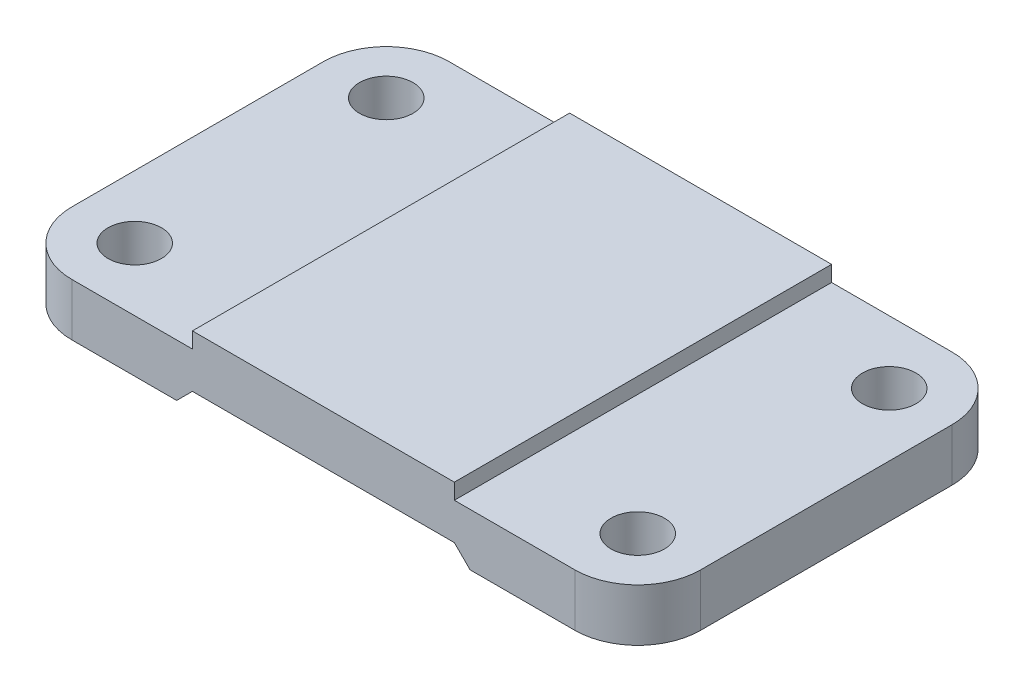
ISO-10303-21;
HEADER;
FILE_DESCRIPTION(('STEP AP214'),'2;1');
FILE_NAME('part.step','',(''),(''),'','','');
FILE_SCHEMA(('AUTOMOTIVE_DESIGN { 1 0 10303 214 1 1 1 1 }'));
ENDSEC;
DATA;
#1=APPLICATION_CONTEXT('core data for automotive mechanical design processes');
#2=APPLICATION_PROTOCOL_DEFINITION('international standard','automotive_design',2000,#1);
#3=PRODUCT_CONTEXT('',#1,'mechanical');
#4=PRODUCT('Part','Part','',(#3));
#5=PRODUCT_RELATED_PRODUCT_CATEGORY('part','',(#4));
#6=PRODUCT_DEFINITION_FORMATION('','',#4);
#7=PRODUCT_DEFINITION_CONTEXT('part definition',#1,'design');
#8=PRODUCT_DEFINITION('design','',#6,#7);
#9=PRODUCT_DEFINITION_SHAPE('','',#8);
#10=(LENGTH_UNIT() NAMED_UNIT(*) SI_UNIT(.MILLI.,.METRE.));
#11=(NAMED_UNIT(*) PLANE_ANGLE_UNIT() SI_UNIT($,.RADIAN.));
#12=(NAMED_UNIT(*) SI_UNIT($,.STERADIAN.) SOLID_ANGLE_UNIT());
#13=UNCERTAINTY_MEASURE_WITH_UNIT(LENGTH_MEASURE(1.E-05),#10,'distance_accuracy_value','');
#14=(GEOMETRIC_REPRESENTATION_CONTEXT(3) GLOBAL_UNCERTAINTY_ASSIGNED_CONTEXT((#13)) GLOBAL_UNIT_ASSIGNED_CONTEXT((#10,
#11,#12)) REPRESENTATION_CONTEXT('',''));
#15=CARTESIAN_POINT('',(0.,0.,0.));
#16=DIRECTION('',(0.,0.,1.));
#17=DIRECTION('',(1.,0.,0.));
#18=AXIS2_PLACEMENT_3D('',#15,#16,#17);
#19=CARTESIAN_POINT('',(48.,13.,36.));
#20=DIRECTION('',(0.,0.,1.));
#21=DIRECTION('',(1.,0.,0.));
#22=AXIS2_PLACEMENT_3D('',#19,#20,#21);
#23=PLANE('',#22);
#24=DIRECTION('',(-1.,0.,0.));
#25=VECTOR('',#24,1.);
#26=CARTESIAN_POINT('',(48.,0.,36.));
#27=LINE('',#26,#25);
#28=CARTESIAN_POINT('',(-28.,0.,36.));
#29=VERTEX_POINT('',#28);
#30=CARTESIAN_POINT('',(-48.,0.,36.));
#31=VERTEX_POINT('',#30);
#32=EDGE_CURVE('E286',#29,#31,#27,.T.);
#33=ORIENTED_EDGE('',*,*,#32,.F.);
#34=DIRECTION('',(0.707106781186546,0.707106781186549,0.));
#35=VECTOR('',#34,1.);
#36=CARTESIAN_POINT('',(-14.,14.,36.));
#37=LINE('',#36,#35);
#38=CARTESIAN_POINT('',(-25.,3.,36.));
#39=VERTEX_POINT('',#38);
#40=EDGE_CURVE('E268',#29,#39,#37,.T.);
#41=ORIENTED_EDGE('',*,*,#40,.T.);
#42=DIRECTION('',(1.,0.,0.));
#43=VECTOR('',#42,1.);
#44=CARTESIAN_POINT('',(0.,3.,36.));
#45=LINE('',#44,#43);
#46=CARTESIAN_POINT('',(25.,3.,36.));
#47=VERTEX_POINT('',#46);
#48=EDGE_CURVE('E480',#39,#47,#45,.T.);
#49=ORIENTED_EDGE('',*,*,#48,.T.);
#50=DIRECTION('',(-0.707106781186548,0.707106781186547,0.));
#51=VECTOR('',#50,1.);
#52=CARTESIAN_POINT('',(14.,14.,36.));
#53=LINE('',#52,#51);
#54=CARTESIAN_POINT('',(28.,0.,36.));
#55=VERTEX_POINT('',#54);
#56=EDGE_CURVE('E280',#55,#47,#53,.T.);
#57=ORIENTED_EDGE('',*,*,#56,.F.);
#58=CARTESIAN_POINT('',(48.,0.,36.));
#59=VERTEX_POINT('',#58);
#60=EDGE_CURVE('E298',#59,#55,#27,.T.);
#61=ORIENTED_EDGE('',*,*,#60,.F.);
#62=DIRECTION('',(0.,-1.,0.));
#63=VECTOR('',#62,1.);
#64=CARTESIAN_POINT('',(48.,13.,36.));
#65=LINE('',#64,#63);
#66=CARTESIAN_POINT('',(48.,10.,36.));
#67=VERTEX_POINT('',#66);
#68=EDGE_CURVE('E162',#67,#59,#65,.T.);
#69=ORIENTED_EDGE('',*,*,#68,.F.);
#70=DIRECTION('',(1.,0.,0.));
#71=VECTOR('',#70,1.);
#72=CARTESIAN_POINT('',(25.,10.,36.));
#73=LINE('',#72,#71);
#74=CARTESIAN_POINT('',(25.,10.,36.));
#75=VERTEX_POINT('',#74);
#76=EDGE_CURVE('E402',#75,#67,#73,.T.);
#77=ORIENTED_EDGE('',*,*,#76,.F.);
#78=DIRECTION('',(0.,-1.,0.));
#79=VECTOR('',#78,1.);
#80=CARTESIAN_POINT('',(25.,13.,36.));
#81=LINE('',#80,#79);
#82=CARTESIAN_POINT('',(25.,13.,36.));
#83=VERTEX_POINT('',#82);
#84=EDGE_CURVE('E398',#83,#75,#81,.T.);
#85=ORIENTED_EDGE('',*,*,#84,.F.);
#86=DIRECTION('',(-1.,0.,0.));
#87=VECTOR('',#86,1.);
#88=CARTESIAN_POINT('',(48.,13.,36.));
#89=LINE('',#88,#87);
#90=CARTESIAN_POINT('',(-25.,13.,36.));
#91=VERTEX_POINT('',#90);
#92=EDGE_CURVE('E332',#83,#91,#89,.T.);
#93=ORIENTED_EDGE('',*,*,#92,.T.);
#94=DIRECTION('',(0.,-1.,0.));
#95=VECTOR('',#94,1.);
#96=CARTESIAN_POINT('',(-25.,13.,36.));
#97=LINE('',#96,#95);
#98=CARTESIAN_POINT('',(-25.,10.,36.));
#99=VERTEX_POINT('',#98);
#100=EDGE_CURVE('E472',#91,#99,#97,.T.);
#101=ORIENTED_EDGE('',*,*,#100,.T.);
#102=DIRECTION('',(-1.,0.,0.));
#103=VECTOR('',#102,1.);
#104=CARTESIAN_POINT('',(-25.,10.,36.));
#105=LINE('',#104,#103);
#106=CARTESIAN_POINT('',(-48.,10.,36.));
#107=VERTEX_POINT('',#106);
#108=EDGE_CURVE('E404',#99,#107,#105,.T.);
#109=ORIENTED_EDGE('',*,*,#108,.T.);
#110=DIRECTION('',(0.,-1.,0.));
#111=VECTOR('',#110,1.);
#112=CARTESIAN_POINT('',(-48.,13.,36.));
#113=LINE('',#112,#111);
#114=EDGE_CURVE('E12',#107,#31,#113,.T.);
#115=ORIENTED_EDGE('',*,*,#114,.T.);
#116=EDGE_LOOP('',(#33,#41,#49,#57,#61,#69,#77,#85,#93,#101,#109,#115));
#117=FACE_BOUND('',#116,.T.);
#118=ADVANCED_FACE('F152',(#117),#23,.T.);
#119=CARTESIAN_POINT('',(-48.,13.,-36.));
#120=DIRECTION('',(0.,0.,-1.));
#121=DIRECTION('',(-1.,0.,0.));
#122=AXIS2_PLACEMENT_3D('',#119,#120,#121);
#123=PLANE('',#122);
#124=DIRECTION('',(1.,0.,0.));
#125=VECTOR('',#124,1.);
#126=CARTESIAN_POINT('',(0.,3.,-36.));
#127=LINE('',#126,#125);
#128=CARTESIAN_POINT('',(-25.,3.,-36.));
#129=VERTEX_POINT('',#128);
#130=CARTESIAN_POINT('',(25.,3.,-36.));
#131=VERTEX_POINT('',#130);
#132=EDGE_CURVE('E292',#129,#131,#127,.T.);
#133=ORIENTED_EDGE('',*,*,#132,.F.);
#134=DIRECTION('',(0.707106781186546,0.707106781186549,0.));
#135=VECTOR('',#134,1.);
#136=CARTESIAN_POINT('',(-14.,14.,-36.));
#137=LINE('',#136,#135);
#138=CARTESIAN_POINT('',(-28.,0.,-36.));
#139=VERTEX_POINT('',#138);
#140=EDGE_CURVE('E481',#139,#129,#137,.T.);
#141=ORIENTED_EDGE('',*,*,#140,.F.);
#142=DIRECTION('',(1.,0.,0.));
#143=VECTOR('',#142,1.);
#144=CARTESIAN_POINT('',(-48.,0.,-36.));
#145=LINE('',#144,#143);
#146=CARTESIAN_POINT('',(-48.,0.,-36.));
#147=VERTEX_POINT('',#146);
#148=EDGE_CURVE('E289',#147,#139,#145,.T.);
#149=ORIENTED_EDGE('',*,*,#148,.F.);
#150=DIRECTION('',(0.,-1.,0.));
#151=VECTOR('',#150,1.);
#152=CARTESIAN_POINT('',(-48.,13.,-36.));
#153=LINE('',#152,#151);
#154=CARTESIAN_POINT('',(-48.,10.,-36.));
#155=VERTEX_POINT('',#154);
#156=EDGE_CURVE('E340',#155,#147,#153,.T.);
#157=ORIENTED_EDGE('',*,*,#156,.F.);
#158=DIRECTION('',(-1.,0.,0.));
#159=VECTOR('',#158,1.);
#160=CARTESIAN_POINT('',(-25.,10.,-36.));
#161=LINE('',#160,#159);
#162=CARTESIAN_POINT('',(-25.,10.,-36.));
#163=VERTEX_POINT('',#162);
#164=EDGE_CURVE('E492',#163,#155,#161,.T.);
#165=ORIENTED_EDGE('',*,*,#164,.F.);
#166=DIRECTION('',(0.,-1.,0.));
#167=VECTOR('',#166,1.);
#168=CARTESIAN_POINT('',(-25.,13.,-36.));
#169=LINE('',#168,#167);
#170=CARTESIAN_POINT('',(-25.,13.,-36.));
#171=VERTEX_POINT('',#170);
#172=EDGE_CURVE('E379',#171,#163,#169,.T.);
#173=ORIENTED_EDGE('',*,*,#172,.F.);
#174=DIRECTION('',(1.,0.,0.));
#175=VECTOR('',#174,1.);
#176=CARTESIAN_POINT('',(-48.,13.,-36.));
#177=LINE('',#176,#175);
#178=CARTESIAN_POINT('',(25.,13.,-36.));
#179=VERTEX_POINT('',#178);
#180=EDGE_CURVE('E337',#171,#179,#177,.T.);
#181=ORIENTED_EDGE('',*,*,#180,.T.);
#182=DIRECTION('',(0.,-1.,0.));
#183=VECTOR('',#182,1.);
#184=CARTESIAN_POINT('',(25.,13.,-36.));
#185=LINE('',#184,#183);
#186=CARTESIAN_POINT('',(25.,10.,-36.));
#187=VERTEX_POINT('',#186);
#188=EDGE_CURVE('E393',#179,#187,#185,.T.);
#189=ORIENTED_EDGE('',*,*,#188,.T.);
#190=DIRECTION('',(1.,0.,0.));
#191=VECTOR('',#190,1.);
#192=CARTESIAN_POINT('',(25.,10.,-36.));
#193=LINE('',#192,#191);
#194=CARTESIAN_POINT('',(48.,10.,-36.));
#195=VERTEX_POINT('',#194);
#196=EDGE_CURVE('E178',#187,#195,#193,.T.);
#197=ORIENTED_EDGE('',*,*,#196,.T.);
#198=DIRECTION('',(0.,-1.,0.));
#199=VECTOR('',#198,1.);
#200=CARTESIAN_POINT('',(48.,13.,-36.));
#201=LINE('',#200,#199);
#202=CARTESIAN_POINT('',(48.,0.,-36.));
#203=VERTEX_POINT('',#202);
#204=EDGE_CURVE('E343',#195,#203,#201,.T.);
#205=ORIENTED_EDGE('',*,*,#204,.T.);
#206=CARTESIAN_POINT('',(28.,0.,-36.));
#207=VERTEX_POINT('',#206);
#208=EDGE_CURVE('E322',#207,#203,#145,.T.);
#209=ORIENTED_EDGE('',*,*,#208,.F.);
#210=DIRECTION('',(-0.707106781186548,0.707106781186547,0.));
#211=VECTOR('',#210,1.);
#212=CARTESIAN_POINT('',(14.,14.,-36.));
#213=LINE('',#212,#211);
#214=EDGE_CURVE('E170',#207,#131,#213,.T.);
#215=ORIENTED_EDGE('',*,*,#214,.T.);
#216=EDGE_LOOP('',(#133,#141,#149,#157,#165,#173,#181,#189,#197,#205,#209,#215));
#217=FACE_BOUND('',#216,.T.);
#218=ADVANCED_FACE('F445',(#217),#123,.T.);
#219=CARTESIAN_POINT('',(-48.,0.,24.));
#220=DIRECTION('',(0.,1.,0.));
#221=DIRECTION('',(0.,0.,1.));
#222=AXIS2_PLACEMENT_3D('',#219,#220,#221);
#223=PLANE('',#222);
#224=CARTESIAN_POINT('',(-48.,0.,24.));
#225=DIRECTION('',(0.,1.,0.));
#226=DIRECTION('',(0.,0.,1.));
#227=AXIS2_PLACEMENT_3D('',#224,#225,#226);
#228=CIRCLE('',#227,5.1);
#229=CARTESIAN_POINT('',(-48.,0.,18.9));
#230=VERTEX_POINT('',#229);
#231=EDGE_CURVE('E307',#230,#230,#228,.T.);
#232=ORIENTED_EDGE('',*,*,#231,.T.);
#233=EDGE_LOOP('',(#232));
#234=FACE_BOUND('',#233,.T.);
#235=CARTESIAN_POINT('',(-48.,0.,-24.));
#236=DIRECTION('',(0.,1.,0.));
#237=DIRECTION('',(0.,0.,1.));
#238=AXIS2_PLACEMENT_3D('',#235,#236,#237);
#239=CIRCLE('',#238,5.1);
#240=CARTESIAN_POINT('',(-48.,0.,-29.1));
#241=VERTEX_POINT('',#240);
#242=EDGE_CURVE('E431',#241,#241,#239,.T.);
#243=ORIENTED_EDGE('',*,*,#242,.T.);
#244=EDGE_LOOP('',(#243));
#245=FACE_BOUND('',#244,.T.);
#246=DIRECTION('',(0.,0.,1.));
#247=VECTOR('',#246,1.);
#248=CARTESIAN_POINT('',(-28.,0.,-36.));
#249=LINE('',#248,#247);
#250=EDGE_CURVE('E271',#139,#29,#249,.T.);
#251=ORIENTED_EDGE('',*,*,#250,.T.);
#252=ORIENTED_EDGE('',*,*,#32,.T.);
#253=CARTESIAN_POINT('',(-48.,0.,24.));
#254=DIRECTION('',(0.,1.,0.));
#255=DIRECTION('',(0.,0.,1.));
#256=AXIS2_PLACEMENT_3D('',#253,#254,#255);
#257=CIRCLE('',#256,12.);
#258=CARTESIAN_POINT('',(-60.,0.,24.));
#259=VERTEX_POINT('',#258);
#260=EDGE_CURVE('E299',#259,#31,#257,.T.);
#261=ORIENTED_EDGE('',*,*,#260,.F.);
#262=DIRECTION('',(0.,0.,-1.));
#263=VECTOR('',#262,1.);
#264=CARTESIAN_POINT('',(-60.,0.,24.));
#265=LINE('',#264,#263);
#266=CARTESIAN_POINT('',(-60.,0.,-24.));
#267=VERTEX_POINT('',#266);
#268=EDGE_CURVE('E328',#259,#267,#265,.T.);
#269=ORIENTED_EDGE('',*,*,#268,.T.);
#270=CARTESIAN_POINT('',(-48.,0.,-24.));
#271=DIRECTION('',(0.,-1.,0.));
#272=DIRECTION('',(0.,0.,-1.));
#273=AXIS2_PLACEMENT_3D('',#270,#271,#272);
#274=CIRCLE('',#273,12.);
#275=EDGE_CURVE('E325',#267,#147,#274,.T.);
#276=ORIENTED_EDGE('',*,*,#275,.T.);
#277=ORIENTED_EDGE('',*,*,#148,.T.);
#278=EDGE_LOOP('',(#251,#252,#261,#269,#276,#277));
#279=FACE_BOUND('',#278,.T.);
#280=ADVANCED_FACE('F284',(#234,#245,#279),#223,.F.);
#281=CARTESIAN_POINT('',(-48.,13.,24.));
#282=DIRECTION('',(0.,1.,0.));
#283=DIRECTION('',(0.,0.,1.));
#284=AXIS2_PLACEMENT_3D('',#281,#282,#283);
#285=PLANE('',#284);
#286=ORIENTED_EDGE('',*,*,#180,.F.);
#287=DIRECTION('',(0.,0.,1.));
#288=VECTOR('',#287,1.);
#289=CARTESIAN_POINT('',(-25.,13.,-36.));
#290=LINE('',#289,#288);
#291=EDGE_CURVE('E358',#171,#91,#290,.T.);
#292=ORIENTED_EDGE('',*,*,#291,.T.);
#293=ORIENTED_EDGE('',*,*,#92,.F.);
#294=DIRECTION('',(0.,0.,1.));
#295=VECTOR('',#294,1.);
#296=CARTESIAN_POINT('',(25.,13.,-36.));
#297=LINE('',#296,#295);
#298=EDGE_CURVE('E391',#179,#83,#297,.T.);
#299=ORIENTED_EDGE('',*,*,#298,.F.);
#300=EDGE_LOOP('',(#286,#292,#293,#299));
#301=FACE_BOUND('',#300,.T.);
#302=ADVANCED_FACE('F448',(#301),#285,.T.);
#303=CARTESIAN_POINT('',(-48.,13.,24.));
#304=DIRECTION('',(0.,-1.,0.));
#305=DIRECTION('',(0.,0.,-1.));
#306=AXIS2_PLACEMENT_3D('',#303,#304,#305);
#307=CYLINDRICAL_SURFACE('',#306,12.);
#308=CARTESIAN_POINT('',(-48.,10.,24.));
#309=DIRECTION('',(0.,1.,0.));
#310=DIRECTION('',(-1.,0.,0.));
#311=AXIS2_PLACEMENT_3D('',#308,#309,#310);
#312=CIRCLE('',#311,12.);
#313=CARTESIAN_POINT('',(-60.,10.,24.));
#314=VERTEX_POINT('',#313);
#315=EDGE_CURVE('E420',#314,#107,#312,.T.);
#316=ORIENTED_EDGE('',*,*,#315,.F.);
#317=DIRECTION('',(0.,-1.,0.));
#318=VECTOR('',#317,1.);
#319=CARTESIAN_POINT('',(-60.,13.,24.));
#320=LINE('',#319,#318);
#321=EDGE_CURVE('E333',#314,#259,#320,.T.);
#322=ORIENTED_EDGE('',*,*,#321,.T.);
#323=ORIENTED_EDGE('',*,*,#260,.T.);
#324=ORIENTED_EDGE('',*,*,#114,.F.);
#325=EDGE_LOOP('',(#316,#322,#323,#324));
#326=FACE_BOUND('',#325,.T.);
#327=ADVANCED_FACE('F154',(#326),#307,.T.);
#328=CARTESIAN_POINT('',(-48.,13.,-24.));
#329=DIRECTION('',(0.,-1.,0.));
#330=DIRECTION('',(0.,0.,-1.));
#331=AXIS2_PLACEMENT_3D('',#328,#329,#330);
#332=CYLINDRICAL_SURFACE('',#331,12.);
#333=DIRECTION('',(0.,-1.,0.));
#334=VECTOR('',#333,1.);
#335=CARTESIAN_POINT('',(-60.,13.,-24.));
#336=LINE('',#335,#334);
#337=CARTESIAN_POINT('',(-60.,10.,-24.));
#338=VERTEX_POINT('',#337);
#339=EDGE_CURVE('E336',#338,#267,#336,.T.);
#340=ORIENTED_EDGE('',*,*,#339,.F.);
#341=CARTESIAN_POINT('',(-48.,10.,-24.));
#342=DIRECTION('',(0.,1.,0.));
#343=DIRECTION('',(-1.,0.,0.));
#344=AXIS2_PLACEMENT_3D('',#341,#342,#343);
#345=CIRCLE('',#344,12.);
#346=EDGE_CURVE('E416',#338,#155,#345,.F.);
#347=ORIENTED_EDGE('',*,*,#346,.T.);
#348=ORIENTED_EDGE('',*,*,#156,.T.);
#349=ORIENTED_EDGE('',*,*,#275,.F.);
#350=EDGE_LOOP('',(#340,#347,#348,#349));
#351=FACE_BOUND('',#350,.T.);
#352=ADVANCED_FACE('F505',(#351),#332,.T.);
#353=CARTESIAN_POINT('',(-60.,13.,24.));
#354=DIRECTION('',(-1.,0.,0.));
#355=DIRECTION('',(0.,0.,1.));
#356=AXIS2_PLACEMENT_3D('',#353,#354,#355);
#357=PLANE('',#356);
#358=ORIENTED_EDGE('',*,*,#321,.F.);
#359=DIRECTION('',(0.,0.,1.));
#360=VECTOR('',#359,1.);
#361=CARTESIAN_POINT('',(-60.,10.,-36.));
#362=LINE('',#361,#360);
#363=EDGE_CURVE('E376',#338,#314,#362,.T.);
#364=ORIENTED_EDGE('',*,*,#363,.F.);
#365=ORIENTED_EDGE('',*,*,#339,.T.);
#366=ORIENTED_EDGE('',*,*,#268,.F.);
#367=EDGE_LOOP('',(#358,#364,#365,#366));
#368=FACE_BOUND('',#367,.T.);
#369=ADVANCED_FACE('F510',(#368),#357,.T.);
#370=CARTESIAN_POINT('',(-48.,13.,24.));
#371=DIRECTION('',(0.,-1.,0.));
#372=DIRECTION('',(0.,0.,-1.));
#373=AXIS2_PLACEMENT_3D('',#370,#371,#372);
#374=CYLINDRICAL_SURFACE('',#373,5.1);
#375=CARTESIAN_POINT('',(-48.,10.,24.));
#376=DIRECTION('',(0.,1.,0.));
#377=DIRECTION('',(-1.,0.,0.));
#378=AXIS2_PLACEMENT_3D('',#375,#376,#377);
#379=CIRCLE('',#378,5.1);
#380=CARTESIAN_POINT('',(-48.,10.,18.9));
#381=VERTEX_POINT('',#380);
#382=EDGE_CURVE('E412',#381,#381,#379,.T.);
#383=CARTESIAN_POINT('',(-48.,0.,18.9));
#384=CARTESIAN_POINT('',(-48.,0.104166666666667,18.9));
#385=CARTESIAN_POINT('',(-48.,0.208333333333334,18.9));
#386=CARTESIAN_POINT('',(-48.,0.416666666666667,18.9));
#387=CARTESIAN_POINT('',(-48.,0.520833333333334,18.9));
#388=CARTESIAN_POINT('',(-48.,0.729166666666667,18.9));
#389=CARTESIAN_POINT('',(-48.,0.833333333333334,18.9));
#390=CARTESIAN_POINT('',(-48.,1.04166666666667,18.9));
#391=CARTESIAN_POINT('',(-48.,1.14583333333333,18.9));
#392=CARTESIAN_POINT('',(-48.,1.35416666666667,18.9));
#393=CARTESIAN_POINT('',(-48.,1.45833333333333,18.9));
#394=CARTESIAN_POINT('',(-48.,1.66666666666667,18.9));
#395=CARTESIAN_POINT('',(-48.,1.77083333333333,18.9));
#396=CARTESIAN_POINT('',(-48.,1.97916666666667,18.9));
#397=CARTESIAN_POINT('',(-48.,2.08333333333333,18.9));
#398=CARTESIAN_POINT('',(-48.,2.29166666666667,18.9));
#399=CARTESIAN_POINT('',(-48.,2.39583333333333,18.9));
#400=CARTESIAN_POINT('',(-48.,2.60416666666667,18.9));
#401=CARTESIAN_POINT('',(-48.,2.70833333333333,18.9));
#402=CARTESIAN_POINT('',(-48.,2.91666666666667,18.9));
#403=CARTESIAN_POINT('',(-48.,3.02083333333333,18.9));
#404=CARTESIAN_POINT('',(-48.,3.22916666666667,18.9));
#405=CARTESIAN_POINT('',(-48.,3.33333333333333,18.9));
#406=CARTESIAN_POINT('',(-48.,3.54166666666667,18.9));
#407=CARTESIAN_POINT('',(-48.,3.64583333333333,18.9));
#408=CARTESIAN_POINT('',(-48.,3.85416666666667,18.9));
#409=CARTESIAN_POINT('',(-48.,3.95833333333333,18.9));
#410=CARTESIAN_POINT('',(-48.,4.16666666666667,18.9));
#411=CARTESIAN_POINT('',(-48.,4.27083333333333,18.9));
#412=CARTESIAN_POINT('',(-48.,4.47916666666667,18.9));
#413=CARTESIAN_POINT('',(-48.,4.58333333333333,18.9));
#414=CARTESIAN_POINT('',(-48.,4.79166666666667,18.9));
#415=CARTESIAN_POINT('',(-48.,4.89583333333333,18.9));
#416=CARTESIAN_POINT('',(-48.,5.10416666666667,18.9));
#417=CARTESIAN_POINT('',(-48.,5.20833333333333,18.9));
#418=CARTESIAN_POINT('',(-48.,5.41666666666667,18.9));
#419=CARTESIAN_POINT('',(-48.,5.52083333333333,18.9));
#420=CARTESIAN_POINT('',(-48.,5.72916666666667,18.9));
#421=CARTESIAN_POINT('',(-48.,5.83333333333333,18.9));
#422=CARTESIAN_POINT('',(-48.,6.04166666666667,18.9));
#423=CARTESIAN_POINT('',(-48.,6.14583333333333,18.9));
#424=CARTESIAN_POINT('',(-48.,6.35416666666667,18.9));
#425=CARTESIAN_POINT('',(-48.,6.45833333333333,18.9));
#426=CARTESIAN_POINT('',(-48.,6.66666666666667,18.9));
#427=CARTESIAN_POINT('',(-48.,6.77083333333333,18.9));
#428=CARTESIAN_POINT('',(-48.,6.97916666666667,18.9));
#429=CARTESIAN_POINT('',(-48.,7.08333333333333,18.9));
#430=CARTESIAN_POINT('',(-48.,7.29166666666667,18.9));
#431=CARTESIAN_POINT('',(-48.,7.39583333333333,18.9));
#432=CARTESIAN_POINT('',(-48.,7.60416666666667,18.9));
#433=CARTESIAN_POINT('',(-48.,7.70833333333333,18.9));
#434=CARTESIAN_POINT('',(-48.,7.91666666666667,18.9));
#435=CARTESIAN_POINT('',(-48.,8.02083333333333,18.9));
#436=CARTESIAN_POINT('',(-48.,8.22916666666667,18.9));
#437=CARTESIAN_POINT('',(-48.,8.33333333333333,18.9));
#438=CARTESIAN_POINT('',(-48.,8.54166666666667,18.9));
#439=CARTESIAN_POINT('',(-48.,8.64583333333333,18.9));
#440=CARTESIAN_POINT('',(-48.,8.85416666666667,18.9));
#441=CARTESIAN_POINT('',(-48.,8.95833333333333,18.9));
#442=CARTESIAN_POINT('',(-48.,9.16666666666667,18.9));
#443=CARTESIAN_POINT('',(-48.,9.27083333333333,18.9));
#444=CARTESIAN_POINT('',(-48.,9.47916666666667,18.9));
#445=CARTESIAN_POINT('',(-48.,9.58333333333333,18.9));
#446=CARTESIAN_POINT('',(-48.,9.79166666666667,18.9));
#447=CARTESIAN_POINT('',(-48.,9.89583333333333,18.9));
#448=CARTESIAN_POINT('',(-48.,10.,18.9));
#449=B_SPLINE_CURVE_WITH_KNOTS('',3,(#383,#384,#385,#386,#387,#388,#389,#390,#391,#392,#393,
#394,#395,#396,#397,#398,#399,#400,#401,#402,#403,#404,#405,#406,#407,#408,#409,#410,#411,#412,
#413,#414,#415,#416,#417,#418,#419,#420,#421,#422,#423,#424,#425,#426,#427,#428,#429,#430,#431,
#432,#433,#434,#435,#436,#437,#438,#439,#440,#441,#442,#443,#444,#445,#446,#447,#448),
.UNSPECIFIED.,.F.,.F.,(4,2,2,2,2,2,2,2,2,2,2,2,2,2,2,2,2,2,2,2,2,2,2,2,2,2,2,2,2,2,2,2,4),(0.,
0.3125,0.625000000000001,0.937500000000001,1.25,1.5625,1.875,2.1875,2.5,2.8125,3.125,3.4375,
3.75,4.0625,4.375,4.6875,5.,5.3125,5.625,5.9375,6.25,6.5625,6.875,7.1875,7.5,7.8125,8.125,
8.4375,8.75,9.0625,9.375,9.6875,10.),.UNSPECIFIED.);
#450=EDGE_CURVE('BSEAM536',#230,#381,#449,.T.);
#451=ORIENTED_EDGE('',*,*,#231,.F.);
#452=ORIENTED_EDGE('',*,*,#382,.T.);
#453=ORIENTED_EDGE('',*,*,#450,.T.);
#454=ORIENTED_EDGE('',*,*,#450,.F.);
#455=EDGE_LOOP('',(#451,#453,#452,#454));
#456=FACE_BOUND('',#455,.T.);
#457=ADVANCED_FACE('F536',(#456),#374,.F.);
#458=CARTESIAN_POINT('',(-48.,13.,-24.));
#459=DIRECTION('',(0.,-1.,0.));
#460=DIRECTION('',(0.,0.,-1.));
#461=AXIS2_PLACEMENT_3D('',#458,#459,#460);
#462=CYLINDRICAL_SURFACE('',#461,5.1);
#463=CARTESIAN_POINT('',(-48.,10.,-24.));
#464=DIRECTION('',(0.,1.,0.));
#465=DIRECTION('',(-1.,0.,0.));
#466=AXIS2_PLACEMENT_3D('',#463,#464,#465);
#467=CIRCLE('',#466,5.1);
#468=CARTESIAN_POINT('',(-48.,10.,-29.1));
#469=VERTEX_POINT('',#468);
#470=EDGE_CURVE('E156',#469,#469,#467,.T.);
#471=CARTESIAN_POINT('',(-48.,0.,-29.1));
#472=CARTESIAN_POINT('',(-48.,0.104166666666667,-29.1));
#473=CARTESIAN_POINT('',(-48.,0.208333333333334,-29.1));
#474=CARTESIAN_POINT('',(-48.,0.416666666666667,-29.1));
#475=CARTESIAN_POINT('',(-48.,0.520833333333334,-29.1));
#476=CARTESIAN_POINT('',(-48.,0.729166666666667,-29.1));
#477=CARTESIAN_POINT('',(-48.,0.833333333333334,-29.1));
#478=CARTESIAN_POINT('',(-48.,1.04166666666667,-29.1));
#479=CARTESIAN_POINT('',(-48.,1.14583333333333,-29.1));
#480=CARTESIAN_POINT('',(-48.,1.35416666666667,-29.1));
#481=CARTESIAN_POINT('',(-48.,1.45833333333333,-29.1));
#482=CARTESIAN_POINT('',(-48.,1.66666666666667,-29.1));
#483=CARTESIAN_POINT('',(-48.,1.77083333333333,-29.1));
#484=CARTESIAN_POINT('',(-48.,1.97916666666667,-29.1));
#485=CARTESIAN_POINT('',(-48.,2.08333333333333,-29.1));
#486=CARTESIAN_POINT('',(-48.,2.29166666666667,-29.1));
#487=CARTESIAN_POINT('',(-48.,2.39583333333333,-29.1));
#488=CARTESIAN_POINT('',(-48.,2.60416666666667,-29.1));
#489=CARTESIAN_POINT('',(-48.,2.70833333333333,-29.1));
#490=CARTESIAN_POINT('',(-48.,2.91666666666667,-29.1));
#491=CARTESIAN_POINT('',(-48.,3.02083333333333,-29.1));
#492=CARTESIAN_POINT('',(-48.,3.22916666666667,-29.1));
#493=CARTESIAN_POINT('',(-48.,3.33333333333333,-29.1));
#494=CARTESIAN_POINT('',(-48.,3.54166666666667,-29.1));
#495=CARTESIAN_POINT('',(-48.,3.64583333333333,-29.1));
#496=CARTESIAN_POINT('',(-48.,3.85416666666667,-29.1));
#497=CARTESIAN_POINT('',(-48.,3.95833333333333,-29.1));
#498=CARTESIAN_POINT('',(-48.,4.16666666666667,-29.1));
#499=CARTESIAN_POINT('',(-48.,4.27083333333333,-29.1));
#500=CARTESIAN_POINT('',(-48.,4.47916666666667,-29.1));
#501=CARTESIAN_POINT('',(-48.,4.58333333333333,-29.1));
#502=CARTESIAN_POINT('',(-48.,4.79166666666667,-29.1));
#503=CARTESIAN_POINT('',(-48.,4.89583333333333,-29.1));
#504=CARTESIAN_POINT('',(-48.,5.10416666666667,-29.1));
#505=CARTESIAN_POINT('',(-48.,5.20833333333333,-29.1));
#506=CARTESIAN_POINT('',(-48.,5.41666666666667,-29.1));
#507=CARTESIAN_POINT('',(-48.,5.52083333333333,-29.1));
#508=CARTESIAN_POINT('',(-48.,5.72916666666667,-29.1));
#509=CARTESIAN_POINT('',(-48.,5.83333333333333,-29.1));
#510=CARTESIAN_POINT('',(-48.,6.04166666666667,-29.1));
#511=CARTESIAN_POINT('',(-48.,6.14583333333333,-29.1));
#512=CARTESIAN_POINT('',(-48.,6.35416666666667,-29.1));
#513=CARTESIAN_POINT('',(-48.,6.45833333333333,-29.1));
#514=CARTESIAN_POINT('',(-48.,6.66666666666667,-29.1));
#515=CARTESIAN_POINT('',(-48.,6.77083333333333,-29.1));
#516=CARTESIAN_POINT('',(-48.,6.97916666666667,-29.1));
#517=CARTESIAN_POINT('',(-48.,7.08333333333333,-29.1));
#518=CARTESIAN_POINT('',(-48.,7.29166666666667,-29.1));
#519=CARTESIAN_POINT('',(-48.,7.39583333333333,-29.1));
#520=CARTESIAN_POINT('',(-48.,7.60416666666667,-29.1));
#521=CARTESIAN_POINT('',(-48.,7.70833333333333,-29.1));
#522=CARTESIAN_POINT('',(-48.,7.91666666666667,-29.1));
#523=CARTESIAN_POINT('',(-48.,8.02083333333333,-29.1));
#524=CARTESIAN_POINT('',(-48.,8.22916666666667,-29.1));
#525=CARTESIAN_POINT('',(-48.,8.33333333333333,-29.1));
#526=CARTESIAN_POINT('',(-48.,8.54166666666667,-29.1));
#527=CARTESIAN_POINT('',(-48.,8.64583333333333,-29.1));
#528=CARTESIAN_POINT('',(-48.,8.85416666666667,-29.1));
#529=CARTESIAN_POINT('',(-48.,8.95833333333333,-29.1));
#530=CARTESIAN_POINT('',(-48.,9.16666666666667,-29.1));
#531=CARTESIAN_POINT('',(-48.,9.27083333333333,-29.1));
#532=CARTESIAN_POINT('',(-48.,9.47916666666667,-29.1));
#533=CARTESIAN_POINT('',(-48.,9.58333333333333,-29.1));
#534=CARTESIAN_POINT('',(-48.,9.79166666666667,-29.1));
#535=CARTESIAN_POINT('',(-48.,9.89583333333333,-29.1));
#536=CARTESIAN_POINT('',(-48.,10.,-29.1));
#537=B_SPLINE_CURVE_WITH_KNOTS('',3,(#471,#472,#473,#474,#475,#476,#477,#478,#479,#480,#481,
#482,#483,#484,#485,#486,#487,#488,#489,#490,#491,#492,#493,#494,#495,#496,#497,#498,#499,#500,
#501,#502,#503,#504,#505,#506,#507,#508,#509,#510,#511,#512,#513,#514,#515,#516,#517,#518,#519,
#520,#521,#522,#523,#524,#525,#526,#527,#528,#529,#530,#531,#532,#533,#534,#535,#536),
.UNSPECIFIED.,.F.,.F.,(4,2,2,2,2,2,2,2,2,2,2,2,2,2,2,2,2,2,2,2,2,2,2,2,2,2,2,2,2,2,2,2,4),(0.,
0.3125,0.625000000000001,0.937500000000001,1.25,1.5625,1.875,2.1875,2.5,2.8125,3.125,3.4375,
3.75,4.0625,4.375,4.6875,5.,5.3125,5.625,5.9375,6.25,6.5625,6.875,7.1875,7.5,7.8125,8.125,
8.4375,8.75,9.0625,9.375,9.6875,10.),.UNSPECIFIED.);
#538=EDGE_CURVE('BSEAM538',#241,#469,#537,.T.);
#539=ORIENTED_EDGE('',*,*,#242,.F.);
#540=ORIENTED_EDGE('',*,*,#470,.T.);
#541=ORIENTED_EDGE('',*,*,#538,.T.);
#542=ORIENTED_EDGE('',*,*,#538,.F.);
#543=EDGE_LOOP('',(#539,#541,#540,#542));
#544=FACE_BOUND('',#543,.T.);
#545=ADVANCED_FACE('F538',(#544),#462,.F.);
#546=CARTESIAN_POINT('',(48.,0.,24.));
#547=DIRECTION('',(0.,-1.,0.));
#548=DIRECTION('',(0.,0.,-1.));
#549=AXIS2_PLACEMENT_3D('',#546,#547,#548);
#550=CIRCLE('',#549,5.09999999999999);
#551=CARTESIAN_POINT('',(48.,0.,18.9));
#552=VERTEX_POINT('',#551);
#553=EDGE_CURVE('E423',#552,#552,#550,.T.);
#554=ORIENTED_EDGE('',*,*,#553,.F.);
#555=EDGE_LOOP('',(#554));
#556=FACE_BOUND('',#555,.T.);
#557=CARTESIAN_POINT('',(48.,0.,-24.));
#558=DIRECTION('',(0.,-1.,0.));
#559=DIRECTION('',(0.,0.,-1.));
#560=AXIS2_PLACEMENT_3D('',#557,#558,#559);
#561=CIRCLE('',#560,5.1);
#562=CARTESIAN_POINT('',(48.,0.,-29.1));
#563=VERTEX_POINT('',#562);
#564=EDGE_CURVE('E427',#563,#563,#561,.T.);
#565=ORIENTED_EDGE('',*,*,#564,.F.);
#566=EDGE_LOOP('',(#565));
#567=FACE_BOUND('',#566,.T.);
#568=ORIENTED_EDGE('',*,*,#60,.T.);
#569=DIRECTION('',(0.,0.,1.));
#570=VECTOR('',#569,1.);
#571=CARTESIAN_POINT('',(28.,0.,-36.));
#572=LINE('',#571,#570);
#573=EDGE_CURVE('E291',#207,#55,#572,.T.);
#574=ORIENTED_EDGE('',*,*,#573,.F.);
#575=ORIENTED_EDGE('',*,*,#208,.T.);
#576=CARTESIAN_POINT('',(48.,0.,-24.));
#577=DIRECTION('',(0.,1.,0.));
#578=DIRECTION('',(0.,0.,1.));
#579=AXIS2_PLACEMENT_3D('',#576,#577,#578);
#580=CIRCLE('',#579,12.);
#581=CARTESIAN_POINT('',(60.,0.,-24.));
#582=VERTEX_POINT('',#581);
#583=EDGE_CURVE('E318',#582,#203,#580,.T.);
#584=ORIENTED_EDGE('',*,*,#583,.F.);
#585=DIRECTION('',(0.,0.,1.));
#586=VECTOR('',#585,1.);
#587=CARTESIAN_POINT('',(60.,0.,-24.));
#588=LINE('',#587,#586);
#589=CARTESIAN_POINT('',(60.,0.,24.));
#590=VERTEX_POINT('',#589);
#591=EDGE_CURVE('E314',#582,#590,#588,.T.);
#592=ORIENTED_EDGE('',*,*,#591,.T.);
#593=CARTESIAN_POINT('',(48.,0.,24.));
#594=DIRECTION('',(0.,1.,0.));
#595=DIRECTION('',(0.,0.,1.));
#596=AXIS2_PLACEMENT_3D('',#593,#594,#595);
#597=CIRCLE('',#596,12.);
#598=EDGE_CURVE('E305',#59,#590,#597,.T.);
#599=ORIENTED_EDGE('',*,*,#598,.F.);
#600=EDGE_LOOP('',(#568,#574,#575,#584,#592,#599));
#601=FACE_BOUND('',#600,.T.);
#602=ADVANCED_FACE('F528',(#556,#567,#601),#223,.F.);
#603=CARTESIAN_POINT('',(48.,13.,24.));
#604=DIRECTION('',(0.,-1.,0.));
#605=DIRECTION('',(0.,0.,-1.));
#606=AXIS2_PLACEMENT_3D('',#603,#604,#605);
#607=CYLINDRICAL_SURFACE('',#606,12.);
#608=DIRECTION('',(0.,-1.,0.));
#609=VECTOR('',#608,1.);
#610=CARTESIAN_POINT('',(60.,13.,24.));
#611=LINE('',#610,#609);
#612=CARTESIAN_POINT('',(60.,10.,24.));
#613=VERTEX_POINT('',#612);
#614=EDGE_CURVE('E350',#613,#590,#611,.T.);
#615=ORIENTED_EDGE('',*,*,#614,.F.);
#616=CARTESIAN_POINT('',(48.,10.,24.));
#617=DIRECTION('',(0.,-1.,0.));
#618=DIRECTION('',(0.,0.,-1.));
#619=AXIS2_PLACEMENT_3D('',#616,#617,#618);
#620=CIRCLE('',#619,12.);
#621=EDGE_CURVE('E409',#613,#67,#620,.T.);
#622=ORIENTED_EDGE('',*,*,#621,.T.);
#623=ORIENTED_EDGE('',*,*,#68,.T.);
#624=ORIENTED_EDGE('',*,*,#598,.T.);
#625=EDGE_LOOP('',(#615,#622,#623,#624));
#626=FACE_BOUND('',#625,.T.);
#627=ADVANCED_FACE('F459',(#626),#607,.T.);
#628=CARTESIAN_POINT('',(60.,13.,-24.));
#629=DIRECTION('',(1.,0.,0.));
#630=DIRECTION('',(0.,0.,-1.));
#631=AXIS2_PLACEMENT_3D('',#628,#629,#630);
#632=PLANE('',#631);
#633=DIRECTION('',(0.,0.,1.));
#634=VECTOR('',#633,1.);
#635=CARTESIAN_POINT('',(60.,10.,-36.));
#636=LINE('',#635,#634);
#637=CARTESIAN_POINT('',(60.,10.,-24.));
#638=VERTEX_POINT('',#637);
#639=EDGE_CURVE('E384',#638,#613,#636,.T.);
#640=ORIENTED_EDGE('',*,*,#639,.T.);
#641=ORIENTED_EDGE('',*,*,#614,.T.);
#642=ORIENTED_EDGE('',*,*,#591,.F.);
#643=DIRECTION('',(0.,-1.,0.));
#644=VECTOR('',#643,1.);
#645=CARTESIAN_POINT('',(60.,13.,-24.));
#646=LINE('',#645,#644);
#647=EDGE_CURVE('E347',#638,#582,#646,.T.);
#648=ORIENTED_EDGE('',*,*,#647,.F.);
#649=EDGE_LOOP('',(#640,#641,#642,#648));
#650=FACE_BOUND('',#649,.T.);
#651=ADVANCED_FACE('F463',(#650),#632,.T.);
#652=CARTESIAN_POINT('',(48.,13.,-24.));
#653=DIRECTION('',(0.,-1.,0.));
#654=DIRECTION('',(0.,0.,-1.));
#655=AXIS2_PLACEMENT_3D('',#652,#653,#654);
#656=CYLINDRICAL_SURFACE('',#655,12.);
#657=ORIENTED_EDGE('',*,*,#204,.F.);
#658=CARTESIAN_POINT('',(48.,10.,-24.));
#659=DIRECTION('',(0.,-1.,0.));
#660=DIRECTION('',(0.,0.,-1.));
#661=AXIS2_PLACEMENT_3D('',#658,#659,#660);
#662=CIRCLE('',#661,12.);
#663=EDGE_CURVE('E364',#195,#638,#662,.T.);
#664=ORIENTED_EDGE('',*,*,#663,.T.);
#665=ORIENTED_EDGE('',*,*,#647,.T.);
#666=ORIENTED_EDGE('',*,*,#583,.T.);
#667=EDGE_LOOP('',(#657,#664,#665,#666));
#668=FACE_BOUND('',#667,.T.);
#669=ADVANCED_FACE('F467',(#668),#656,.T.);
#670=CARTESIAN_POINT('',(48.,13.,-24.));
#671=DIRECTION('',(0.,-1.,0.));
#672=DIRECTION('',(0.,0.,-1.));
#673=AXIS2_PLACEMENT_3D('',#670,#671,#672);
#674=CYLINDRICAL_SURFACE('',#673,5.1);
#675=CARTESIAN_POINT('',(48.,10.,-24.));
#676=DIRECTION('',(0.,-1.,0.));
#677=DIRECTION('',(0.,0.,-1.));
#678=AXIS2_PLACEMENT_3D('',#675,#676,#677);
#679=CIRCLE('',#678,5.1);
#680=CARTESIAN_POINT('',(48.,10.,-29.1));
#681=VERTEX_POINT('',#680);
#682=EDGE_CURVE('E357',#681,#681,#679,.F.);
#683=CARTESIAN_POINT('',(48.,10.,-29.1));
#684=CARTESIAN_POINT('',(48.,9.89583333333334,-29.1));
#685=CARTESIAN_POINT('',(48.,9.79166666666667,-29.1));
#686=CARTESIAN_POINT('',(48.,9.58333333333334,-29.1));
#687=CARTESIAN_POINT('',(48.,9.47916666666667,-29.1));
#688=CARTESIAN_POINT('',(48.,9.27083333333334,-29.1));
#689=CARTESIAN_POINT('',(48.,9.16666666666667,-29.1));
#690=CARTESIAN_POINT('',(48.,8.95833333333334,-29.1));
#691=CARTESIAN_POINT('',(48.,8.85416666666667,-29.1));
#692=CARTESIAN_POINT('',(48.,8.64583333333334,-29.1));
#693=CARTESIAN_POINT('',(48.,8.54166666666667,-29.1));
#694=CARTESIAN_POINT('',(48.,8.33333333333334,-29.1));
#695=CARTESIAN_POINT('',(48.,8.22916666666667,-29.1));
#696=CARTESIAN_POINT('',(48.,8.02083333333334,-29.1));
#697=CARTESIAN_POINT('',(48.,7.91666666666667,-29.1));
#698=CARTESIAN_POINT('',(48.,7.70833333333334,-29.1));
#699=CARTESIAN_POINT('',(48.,7.60416666666667,-29.1));
#700=CARTESIAN_POINT('',(48.,7.39583333333334,-29.1));
#701=CARTESIAN_POINT('',(48.,7.29166666666667,-29.1));
#702=CARTESIAN_POINT('',(48.,7.08333333333334,-29.1));
#703=CARTESIAN_POINT('',(48.,6.97916666666667,-29.1));
#704=CARTESIAN_POINT('',(48.,6.77083333333334,-29.1));
#705=CARTESIAN_POINT('',(48.,6.66666666666667,-29.1));
#706=CARTESIAN_POINT('',(48.,6.45833333333333,-29.1));
#707=CARTESIAN_POINT('',(48.,6.35416666666667,-29.1));
#708=CARTESIAN_POINT('',(48.,6.14583333333333,-29.1));
#709=CARTESIAN_POINT('',(48.,6.04166666666667,-29.1));
#710=CARTESIAN_POINT('',(48.,5.83333333333334,-29.1));
#711=CARTESIAN_POINT('',(48.,5.72916666666667,-29.1));
#712=CARTESIAN_POINT('',(48.,5.52083333333333,-29.1));
#713=CARTESIAN_POINT('',(48.,5.41666666666667,-29.1));
#714=CARTESIAN_POINT('',(48.,5.20833333333333,-29.1));
#715=CARTESIAN_POINT('',(48.,5.10416666666667,-29.1));
#716=CARTESIAN_POINT('',(48.,4.89583333333333,-29.1));
#717=CARTESIAN_POINT('',(48.,4.79166666666667,-29.1));
#718=CARTESIAN_POINT('',(48.,4.58333333333333,-29.1));
#719=CARTESIAN_POINT('',(48.,4.47916666666667,-29.1));
#720=CARTESIAN_POINT('',(48.,4.27083333333333,-29.1));
#721=CARTESIAN_POINT('',(48.,4.16666666666667,-29.1));
#722=CARTESIAN_POINT('',(48.,3.95833333333333,-29.1));
#723=CARTESIAN_POINT('',(48.,3.85416666666667,-29.1));
#724=CARTESIAN_POINT('',(48.,3.64583333333333,-29.1));
#725=CARTESIAN_POINT('',(48.,3.54166666666667,-29.1));
#726=CARTESIAN_POINT('',(48.,3.33333333333333,-29.1));
#727=CARTESIAN_POINT('',(48.,3.22916666666667,-29.1));
#728=CARTESIAN_POINT('',(48.,3.02083333333333,-29.1));
#729=CARTESIAN_POINT('',(48.,2.91666666666667,-29.1));
#730=CARTESIAN_POINT('',(48.,2.70833333333333,-29.1));
#731=CARTESIAN_POINT('',(48.,2.60416666666667,-29.1));
#732=CARTESIAN_POINT('',(48.,2.39583333333333,-29.1));
#733=CARTESIAN_POINT('',(48.,2.29166666666667,-29.1));
#734=CARTESIAN_POINT('',(48.,2.08333333333334,-29.1));
#735=CARTESIAN_POINT('',(48.,1.97916666666667,-29.1));
#736=CARTESIAN_POINT('',(48.,1.77083333333334,-29.1));
#737=CARTESIAN_POINT('',(48.,1.66666666666667,-29.1));
#738=CARTESIAN_POINT('',(48.,1.45833333333333,-29.1));
#739=CARTESIAN_POINT('',(48.,1.35416666666667,-29.1));
#740=CARTESIAN_POINT('',(48.,1.14583333333333,-29.1));
#741=CARTESIAN_POINT('',(48.,1.04166666666667,-29.1));
#742=CARTESIAN_POINT('',(48.,0.833333333333334,-29.1));
#743=CARTESIAN_POINT('',(48.,0.729166666666667,-29.1));
#744=CARTESIAN_POINT('',(48.,0.520833333333334,-29.1));
#745=CARTESIAN_POINT('',(48.,0.416666666666667,-29.1));
#746=CARTESIAN_POINT('',(48.,0.208333333333334,-29.1));
#747=CARTESIAN_POINT('',(48.,0.104166666666667,-29.1));
#748=CARTESIAN_POINT('',(48.,0.,-29.1));
#749=B_SPLINE_CURVE_WITH_KNOTS('',3,(#683,#684,#685,#686,#687,#688,#689,#690,#691,#692,#693,
#694,#695,#696,#697,#698,#699,#700,#701,#702,#703,#704,#705,#706,#707,#708,#709,#710,#711,#712,
#713,#714,#715,#716,#717,#718,#719,#720,#721,#722,#723,#724,#725,#726,#727,#728,#729,#730,#731,
#732,#733,#734,#735,#736,#737,#738,#739,#740,#741,#742,#743,#744,#745,#746,#747,#748),
.UNSPECIFIED.,.F.,.F.,(4,2,2,2,2,2,2,2,2,2,2,2,2,2,2,2,2,2,2,2,2,2,2,2,2,2,2,2,2,2,2,2,4),(0.,
0.3125,0.625000000000001,0.937500000000001,1.25,1.5625,1.875,2.1875,2.5,2.8125,3.125,3.4375,
3.75,4.0625,4.375,4.6875,5.,5.3125,5.625,5.9375,6.25,6.5625,6.875,7.1875,7.5,7.8125,8.125,
8.4375,8.75,9.0625,9.375,9.6875,10.),.UNSPECIFIED.);
#750=EDGE_CURVE('BSEAM532',#681,#563,#749,.T.);
#751=ORIENTED_EDGE('',*,*,#682,.T.);
#752=ORIENTED_EDGE('',*,*,#564,.T.);
#753=ORIENTED_EDGE('',*,*,#750,.T.);
#754=ORIENTED_EDGE('',*,*,#750,.F.);
#755=EDGE_LOOP('',(#751,#753,#752,#754));
#756=FACE_BOUND('',#755,.T.);
#757=ADVANCED_FACE('F532',(#756),#674,.F.);
#758=CARTESIAN_POINT('',(48.,13.,24.));
#759=DIRECTION('',(0.,-1.,0.));
#760=DIRECTION('',(0.,0.,-1.));
#761=AXIS2_PLACEMENT_3D('',#758,#759,#760);
#762=CYLINDRICAL_SURFACE('',#761,5.09999999999999);
#763=CARTESIAN_POINT('',(48.,10.,24.));
#764=DIRECTION('',(0.,-1.,0.));
#765=DIRECTION('',(0.,0.,-1.));
#766=AXIS2_PLACEMENT_3D('',#763,#764,#765);
#767=CIRCLE('',#766,5.09999999999999);
#768=CARTESIAN_POINT('',(48.,10.,18.9));
#769=VERTEX_POINT('',#768);
#770=EDGE_CURVE('E354',#769,#769,#767,.F.);
#771=CARTESIAN_POINT('',(48.,10.,18.9));
#772=CARTESIAN_POINT('',(48.,9.89583333333334,18.9));
#773=CARTESIAN_POINT('',(48.,9.79166666666667,18.9));
#774=CARTESIAN_POINT('',(48.,9.58333333333334,18.9));
#775=CARTESIAN_POINT('',(48.,9.47916666666667,18.9));
#776=CARTESIAN_POINT('',(48.,9.27083333333334,18.9));
#777=CARTESIAN_POINT('',(48.,9.16666666666667,18.9));
#778=CARTESIAN_POINT('',(48.,8.95833333333334,18.9));
#779=CARTESIAN_POINT('',(48.,8.85416666666667,18.9));
#780=CARTESIAN_POINT('',(48.,8.64583333333334,18.9));
#781=CARTESIAN_POINT('',(48.,8.54166666666667,18.9));
#782=CARTESIAN_POINT('',(48.,8.33333333333334,18.9));
#783=CARTESIAN_POINT('',(48.,8.22916666666667,18.9));
#784=CARTESIAN_POINT('',(48.,8.02083333333334,18.9));
#785=CARTESIAN_POINT('',(48.,7.91666666666667,18.9));
#786=CARTESIAN_POINT('',(48.,7.70833333333334,18.9));
#787=CARTESIAN_POINT('',(48.,7.60416666666667,18.9));
#788=CARTESIAN_POINT('',(48.,7.39583333333334,18.9));
#789=CARTESIAN_POINT('',(48.,7.29166666666667,18.9));
#790=CARTESIAN_POINT('',(48.,7.08333333333334,18.9));
#791=CARTESIAN_POINT('',(48.,6.97916666666667,18.9));
#792=CARTESIAN_POINT('',(48.,6.77083333333334,18.9));
#793=CARTESIAN_POINT('',(48.,6.66666666666667,18.9));
#794=CARTESIAN_POINT('',(48.,6.45833333333333,18.9));
#795=CARTESIAN_POINT('',(48.,6.35416666666667,18.9));
#796=CARTESIAN_POINT('',(48.,6.14583333333333,18.9));
#797=CARTESIAN_POINT('',(48.,6.04166666666667,18.9));
#798=CARTESIAN_POINT('',(48.,5.83333333333334,18.9));
#799=CARTESIAN_POINT('',(48.,5.72916666666667,18.9));
#800=CARTESIAN_POINT('',(48.,5.52083333333333,18.9));
#801=CARTESIAN_POINT('',(48.,5.41666666666667,18.9));
#802=CARTESIAN_POINT('',(48.,5.20833333333333,18.9));
#803=CARTESIAN_POINT('',(48.,5.10416666666667,18.9));
#804=CARTESIAN_POINT('',(48.,4.89583333333333,18.9));
#805=CARTESIAN_POINT('',(48.,4.79166666666667,18.9));
#806=CARTESIAN_POINT('',(48.,4.58333333333333,18.9));
#807=CARTESIAN_POINT('',(48.,4.47916666666667,18.9));
#808=CARTESIAN_POINT('',(48.,4.27083333333333,18.9));
#809=CARTESIAN_POINT('',(48.,4.16666666666667,18.9));
#810=CARTESIAN_POINT('',(48.,3.95833333333333,18.9));
#811=CARTESIAN_POINT('',(48.,3.85416666666667,18.9));
#812=CARTESIAN_POINT('',(48.,3.64583333333333,18.9));
#813=CARTESIAN_POINT('',(48.,3.54166666666667,18.9));
#814=CARTESIAN_POINT('',(48.,3.33333333333333,18.9));
#815=CARTESIAN_POINT('',(48.,3.22916666666667,18.9));
#816=CARTESIAN_POINT('',(48.,3.02083333333333,18.9));
#817=CARTESIAN_POINT('',(48.,2.91666666666667,18.9));
#818=CARTESIAN_POINT('',(48.,2.70833333333333,18.9));
#819=CARTESIAN_POINT('',(48.,2.60416666666667,18.9));
#820=CARTESIAN_POINT('',(48.,2.39583333333333,18.9));
#821=CARTESIAN_POINT('',(48.,2.29166666666667,18.9));
#822=CARTESIAN_POINT('',(48.,2.08333333333334,18.9));
#823=CARTESIAN_POINT('',(48.,1.97916666666667,18.9));
#824=CARTESIAN_POINT('',(48.,1.77083333333334,18.9));
#825=CARTESIAN_POINT('',(48.,1.66666666666667,18.9));
#826=CARTESIAN_POINT('',(48.,1.45833333333333,18.9));
#827=CARTESIAN_POINT('',(48.,1.35416666666667,18.9));
#828=CARTESIAN_POINT('',(48.,1.14583333333333,18.9));
#829=CARTESIAN_POINT('',(48.,1.04166666666667,18.9));
#830=CARTESIAN_POINT('',(48.,0.833333333333334,18.9));
#831=CARTESIAN_POINT('',(48.,0.729166666666667,18.9));
#832=CARTESIAN_POINT('',(48.,0.520833333333334,18.9));
#833=CARTESIAN_POINT('',(48.,0.416666666666667,18.9));
#834=CARTESIAN_POINT('',(48.,0.208333333333334,18.9));
#835=CARTESIAN_POINT('',(48.,0.104166666666667,18.9));
#836=CARTESIAN_POINT('',(48.,0.,18.9));
#837=B_SPLINE_CURVE_WITH_KNOTS('',3,(#771,#772,#773,#774,#775,#776,#777,#778,#779,#780,#781,
#782,#783,#784,#785,#786,#787,#788,#789,#790,#791,#792,#793,#794,#795,#796,#797,#798,#799,#800,
#801,#802,#803,#804,#805,#806,#807,#808,#809,#810,#811,#812,#813,#814,#815,#816,#817,#818,#819,
#820,#821,#822,#823,#824,#825,#826,#827,#828,#829,#830,#831,#832,#833,#834,#835,#836),
.UNSPECIFIED.,.F.,.F.,(4,2,2,2,2,2,2,2,2,2,2,2,2,2,2,2,2,2,2,2,2,2,2,2,2,2,2,2,2,2,2,2,4),(0.,
0.3125,0.625000000000001,0.937500000000001,1.25,1.5625,1.875,2.1875,2.5,2.8125,3.125,3.4375,
3.75,4.0625,4.375,4.6875,5.,5.3125,5.625,5.9375,6.25,6.5625,6.875,7.1875,7.5,7.8125,8.125,
8.4375,8.75,9.0625,9.375,9.6875,10.),.UNSPECIFIED.);
#838=EDGE_CURVE('BSEAM549',#769,#552,#837,.T.);
#839=ORIENTED_EDGE('',*,*,#770,.T.);
#840=ORIENTED_EDGE('',*,*,#553,.T.);
#841=ORIENTED_EDGE('',*,*,#838,.T.);
#842=ORIENTED_EDGE('',*,*,#838,.F.);
#843=EDGE_LOOP('',(#839,#841,#840,#842));
#844=FACE_BOUND('',#843,.T.);
#845=ADVANCED_FACE('F549',(#844),#762,.F.);
#846=CARTESIAN_POINT('',(25.,10.,-36.));
#847=DIRECTION('',(0.,-1.,0.));
#848=DIRECTION('',(0.,0.,-1.));
#849=AXIS2_PLACEMENT_3D('',#846,#847,#848);
#850=PLANE('',#849);
#851=ORIENTED_EDGE('',*,*,#770,.F.);
#852=EDGE_LOOP('',(#851));
#853=FACE_BOUND('',#852,.T.);
#854=ORIENTED_EDGE('',*,*,#682,.F.);
#855=EDGE_LOOP('',(#854));
#856=FACE_BOUND('',#855,.T.);
#857=ORIENTED_EDGE('',*,*,#639,.F.);
#858=ORIENTED_EDGE('',*,*,#663,.F.);
#859=ORIENTED_EDGE('',*,*,#196,.F.);
#860=DIRECTION('',(0.,0.,1.));
#861=VECTOR('',#860,1.);
#862=CARTESIAN_POINT('',(25.,10.,-36.));
#863=LINE('',#862,#861);
#864=EDGE_CURVE('E388',#187,#75,#863,.T.);
#865=ORIENTED_EDGE('',*,*,#864,.T.);
#866=ORIENTED_EDGE('',*,*,#76,.T.);
#867=ORIENTED_EDGE('',*,*,#621,.F.);
#868=EDGE_LOOP('',(#857,#858,#859,#865,#866,#867));
#869=FACE_BOUND('',#868,.T.);
#870=ADVANCED_FACE('F456',(#853,#856,#869),#850,.F.);
#871=CARTESIAN_POINT('',(25.,13.,-36.));
#872=DIRECTION('',(-1.,0.,0.));
#873=DIRECTION('',(0.,-1.,0.));
#874=AXIS2_PLACEMENT_3D('',#871,#872,#873);
#875=PLANE('',#874);
#876=ORIENTED_EDGE('',*,*,#864,.F.);
#877=ORIENTED_EDGE('',*,*,#188,.F.);
#878=ORIENTED_EDGE('',*,*,#298,.T.);
#879=ORIENTED_EDGE('',*,*,#84,.T.);
#880=EDGE_LOOP('',(#876,#877,#878,#879));
#881=FACE_BOUND('',#880,.T.);
#882=ADVANCED_FACE('F451',(#881),#875,.F.);
#883=CARTESIAN_POINT('',(-25.,10.,-36.));
#884=DIRECTION('',(0.,1.,0.));
#885=DIRECTION('',(-1.,0.,0.));
#886=AXIS2_PLACEMENT_3D('',#883,#884,#885);
#887=PLANE('',#886);
#888=ORIENTED_EDGE('',*,*,#470,.F.);
#889=EDGE_LOOP('',(#888));
#890=FACE_BOUND('',#889,.T.);
#891=ORIENTED_EDGE('',*,*,#382,.F.);
#892=EDGE_LOOP('',(#891));
#893=FACE_BOUND('',#892,.T.);
#894=ORIENTED_EDGE('',*,*,#315,.T.);
#895=ORIENTED_EDGE('',*,*,#108,.F.);
#896=DIRECTION('',(0.,0.,1.));
#897=VECTOR('',#896,1.);
#898=CARTESIAN_POINT('',(-25.,10.,-36.));
#899=LINE('',#898,#897);
#900=EDGE_CURVE('E368',#163,#99,#899,.T.);
#901=ORIENTED_EDGE('',*,*,#900,.F.);
#902=ORIENTED_EDGE('',*,*,#164,.T.);
#903=ORIENTED_EDGE('',*,*,#346,.F.);
#904=ORIENTED_EDGE('',*,*,#363,.T.);
#905=EDGE_LOOP('',(#894,#895,#901,#902,#903,#904));
#906=FACE_BOUND('',#905,.T.);
#907=ADVANCED_FACE('F500',(#890,#893,#906),#887,.T.);
#908=CARTESIAN_POINT('',(-25.,13.,-36.));
#909=DIRECTION('',(-1.,0.,0.));
#910=DIRECTION('',(0.,-1.,0.));
#911=AXIS2_PLACEMENT_3D('',#908,#909,#910);
#912=PLANE('',#911);
#913=ORIENTED_EDGE('',*,*,#291,.F.);
#914=ORIENTED_EDGE('',*,*,#172,.T.);
#915=ORIENTED_EDGE('',*,*,#900,.T.);
#916=ORIENTED_EDGE('',*,*,#100,.F.);
#917=EDGE_LOOP('',(#913,#914,#915,#916));
#918=FACE_BOUND('',#917,.T.);
#919=ADVANCED_FACE('F498',(#918),#912,.T.);
#920=CARTESIAN_POINT('',(-14.,14.,-36.));
#921=DIRECTION('',(0.707106781186549,-0.707106781186546,0.));
#922=DIRECTION('',(0.707106781186546,0.707106781186549,0.));
#923=AXIS2_PLACEMENT_3D('',#920,#921,#922);
#924=PLANE('',#923);
#925=ORIENTED_EDGE('',*,*,#250,.F.);
#926=ORIENTED_EDGE('',*,*,#140,.T.);
#927=DIRECTION('',(0.,0.,1.));
#928=VECTOR('',#927,1.);
#929=CARTESIAN_POINT('',(-25.,3.,-36.));
#930=LINE('',#929,#928);
#931=EDGE_CURVE('E274',#129,#39,#930,.T.);
#932=ORIENTED_EDGE('',*,*,#931,.T.);
#933=ORIENTED_EDGE('',*,*,#40,.F.);
#934=EDGE_LOOP('',(#925,#926,#932,#933));
#935=FACE_BOUND('',#934,.T.);
#936=ADVANCED_FACE('F270',(#935),#924,.T.);
#937=CARTESIAN_POINT('',(0.,3.,-36.));
#938=DIRECTION('',(0.,-1.,0.));
#939=DIRECTION('',(0.,0.,-1.));
#940=AXIS2_PLACEMENT_3D('',#937,#938,#939);
#941=PLANE('',#940);
#942=ORIENTED_EDGE('',*,*,#931,.F.);
#943=ORIENTED_EDGE('',*,*,#132,.T.);
#944=DIRECTION('',(0.,0.,1.));
#945=VECTOR('',#944,1.);
#946=CARTESIAN_POINT('',(25.,3.,-36.));
#947=LINE('',#946,#945);
#948=EDGE_CURVE('E477',#131,#47,#947,.T.);
#949=ORIENTED_EDGE('',*,*,#948,.T.);
#950=ORIENTED_EDGE('',*,*,#48,.F.);
#951=EDGE_LOOP('',(#942,#943,#949,#950));
#952=FACE_BOUND('',#951,.T.);
#953=ADVANCED_FACE('F565',(#952),#941,.T.);
#954=CARTESIAN_POINT('',(14.,14.,-36.));
#955=DIRECTION('',(0.707106781186547,0.707106781186548,0.));
#956=DIRECTION('',(-0.707106781186548,0.707106781186547,0.));
#957=AXIS2_PLACEMENT_3D('',#954,#955,#956);
#958=PLANE('',#957);
#959=ORIENTED_EDGE('',*,*,#948,.F.);
#960=ORIENTED_EDGE('',*,*,#214,.F.);
#961=ORIENTED_EDGE('',*,*,#573,.T.);
#962=ORIENTED_EDGE('',*,*,#56,.T.);
#963=EDGE_LOOP('',(#959,#960,#961,#962));
#964=FACE_BOUND('',#963,.T.);
#965=ADVANCED_FACE('F566',(#964),#958,.F.);
#966=CLOSED_SHELL('',(#118,#218,#280,#302,#327,#352,#369,#457,#545,#602,#627,#651,#669,#757,
#845,#870,#882,#907,#919,#936,#953,#965));
#967=MANIFOLD_SOLID_BREP('B2',#966);
#968=ADVANCED_BREP_SHAPE_REPRESENTATION('',(#18,#967),#14);
#969=SHAPE_DEFINITION_REPRESENTATION(#9,#968);
ENDSEC;
END-ISO-10303-21;
